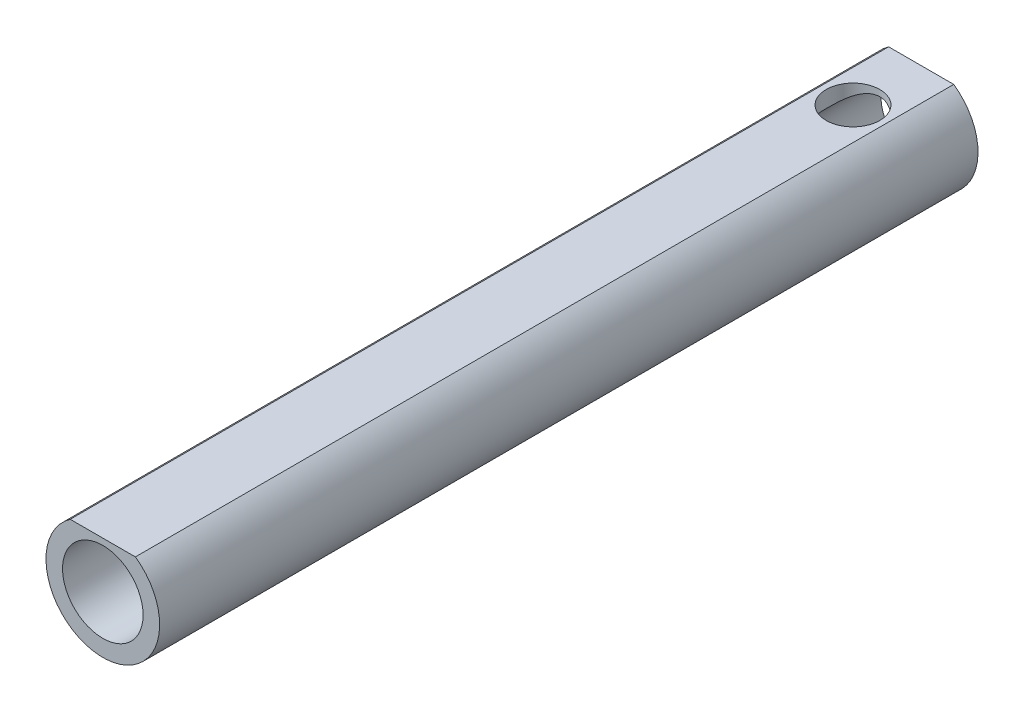
ISO-10303-21;
HEADER;
FILE_DESCRIPTION(('STEP AP214'),'2;1');
FILE_NAME('part.step','',(''),(''),'','','');
FILE_SCHEMA(('AUTOMOTIVE_DESIGN { 1 0 10303 214 1 1 1 1 }'));
ENDSEC;
DATA;
#1=APPLICATION_CONTEXT('core data for automotive mechanical design processes');
#2=APPLICATION_PROTOCOL_DEFINITION('international standard','automotive_design',2000,#1);
#3=PRODUCT_CONTEXT('',#1,'mechanical');
#4=PRODUCT('Part','Part','',(#3));
#5=PRODUCT_RELATED_PRODUCT_CATEGORY('part','',(#4));
#6=PRODUCT_DEFINITION_FORMATION('','',#4);
#7=PRODUCT_DEFINITION_CONTEXT('part definition',#1,'design');
#8=PRODUCT_DEFINITION('design','',#6,#7);
#9=PRODUCT_DEFINITION_SHAPE('','',#8);
#10=(LENGTH_UNIT() NAMED_UNIT(*) SI_UNIT(.MILLI.,.METRE.));
#11=(NAMED_UNIT(*) PLANE_ANGLE_UNIT() SI_UNIT($,.RADIAN.));
#12=(NAMED_UNIT(*) SI_UNIT($,.STERADIAN.) SOLID_ANGLE_UNIT());
#13=UNCERTAINTY_MEASURE_WITH_UNIT(LENGTH_MEASURE(1.E-05),#10,'distance_accuracy_value','');
#14=(GEOMETRIC_REPRESENTATION_CONTEXT(3) GLOBAL_UNCERTAINTY_ASSIGNED_CONTEXT((#13)) GLOBAL_UNIT_ASSIGNED_CONTEXT((#10,
#11,#12)) REPRESENTATION_CONTEXT('',''));
#15=CARTESIAN_POINT('',(0.,0.,0.));
#16=DIRECTION('',(0.,0.,1.));
#17=DIRECTION('',(1.,0.,0.));
#18=AXIS2_PLACEMENT_3D('',#15,#16,#17);
#19=CARTESIAN_POINT('',(0.,0.,45.72));
#20=DIRECTION('',(0.,0.,1.));
#21=DIRECTION('',(1.,0.,0.));
#22=AXIS2_PLACEMENT_3D('',#19,#20,#21);
#23=PLANE('',#22);
#24=DIRECTION('',(1.,0.,0.));
#25=VECTOR('',#24,1.);
#26=CARTESIAN_POINT('',(-1.81964885550264,2.60182686638983,45.72));
#27=LINE('',#26,#25);
#28=CARTESIAN_POINT('',(-1.81964885550264,2.60182686638983,45.72));
#29=VERTEX_POINT('',#28);
#30=CARTESIAN_POINT('',(1.81964885550264,2.60182686638983,45.72));
#31=VERTEX_POINT('',#30);
#32=EDGE_CURVE('E55',#29,#31,#27,.T.);
#33=ORIENTED_EDGE('',*,*,#32,.F.);
#34=CARTESIAN_POINT('',(0.,0.,45.72));
#35=DIRECTION('',(0.,0.,1.));
#36=DIRECTION('',(1.,0.,0.));
#37=AXIS2_PLACEMENT_3D('',#34,#35,#36);
#38=CIRCLE('',#37,3.175);
#39=EDGE_CURVE('E72',#29,#31,#38,.T.);
#40=ORIENTED_EDGE('',*,*,#39,.T.);
#41=EDGE_LOOP('',(#33,#40));
#42=FACE_BOUND('',#41,.T.);
#43=CARTESIAN_POINT('',(0.,0.,45.72));
#44=DIRECTION('',(0.,0.,1.));
#45=DIRECTION('',(1.,0.,0.));
#46=AXIS2_PLACEMENT_3D('',#43,#44,#45);
#47=CIRCLE('',#46,2.25);
#48=CARTESIAN_POINT('',(2.25,0.,45.72));
#49=VERTEX_POINT('',#48);
#50=EDGE_CURVE('E81',#49,#49,#47,.T.);
#51=ORIENTED_EDGE('',*,*,#50,.F.);
#52=EDGE_LOOP('',(#51));
#53=FACE_BOUND('',#52,.T.);
#54=ADVANCED_FACE('F39',(#42,#53),#23,.T.);
#55=CARTESIAN_POINT('',(0.,0.,0.));
#56=DIRECTION('',(0.,0.,1.));
#57=DIRECTION('',(1.,0.,0.));
#58=AXIS2_PLACEMENT_3D('',#55,#56,#57);
#59=PLANE('',#58);
#60=CARTESIAN_POINT('',(0.,0.,0.));
#61=DIRECTION('',(0.,0.,1.));
#62=DIRECTION('',(1.,0.,0.));
#63=AXIS2_PLACEMENT_3D('',#60,#61,#62);
#64=CIRCLE('',#63,3.175);
#65=CARTESIAN_POINT('',(-1.81964885550264,2.60182686638983,0.));
#66=VERTEX_POINT('',#65);
#67=CARTESIAN_POINT('',(1.81964885550264,2.60182686638983,0.));
#68=VERTEX_POINT('',#67);
#69=EDGE_CURVE('E77',#66,#68,#64,.T.);
#70=ORIENTED_EDGE('',*,*,#69,.F.);
#71=DIRECTION('',(1.,0.,0.));
#72=VECTOR('',#71,1.);
#73=CARTESIAN_POINT('',(0.,2.60182686638983,0.));
#74=LINE('',#73,#72);
#75=EDGE_CURVE('E64',#66,#68,#74,.T.);
#76=ORIENTED_EDGE('',*,*,#75,.T.);
#77=EDGE_LOOP('',(#70,#76));
#78=FACE_BOUND('',#77,.T.);
#79=CARTESIAN_POINT('',(0.,0.,0.));
#80=DIRECTION('',(0.,0.,1.));
#81=DIRECTION('',(1.,0.,0.));
#82=AXIS2_PLACEMENT_3D('',#79,#80,#81);
#83=CIRCLE('',#82,2.25);
#84=CARTESIAN_POINT('',(2.25,0.,0.));
#85=VERTEX_POINT('',#84);
#86=EDGE_CURVE('E84',#85,#85,#83,.T.);
#87=ORIENTED_EDGE('',*,*,#86,.T.);
#88=EDGE_LOOP('',(#87));
#89=FACE_BOUND('',#88,.T.);
#90=ADVANCED_FACE('F118',(#78,#89),#59,.F.);
#91=CARTESIAN_POINT('',(0.,0.,45.72));
#92=DIRECTION('',(0.,0.,-1.));
#93=DIRECTION('',(-1.,0.,0.));
#94=AXIS2_PLACEMENT_3D('',#91,#92,#93);
#95=CYLINDRICAL_SURFACE('',#94,3.175);
#96=ORIENTED_EDGE('',*,*,#39,.F.);
#97=DIRECTION('',(0.,0.,-1.));
#98=VECTOR('',#97,1.);
#99=CARTESIAN_POINT('',(-1.81964885550264,2.60182686638983,45.72));
#100=LINE('',#99,#98);
#101=EDGE_CURVE('E11',#29,#66,#100,.T.);
#102=ORIENTED_EDGE('',*,*,#101,.T.);
#103=ORIENTED_EDGE('',*,*,#69,.T.);
#104=DIRECTION('',(0.,0.,-1.));
#105=VECTOR('',#104,1.);
#106=CARTESIAN_POINT('',(1.81964885550264,2.60182686638983,45.72));
#107=LINE('',#106,#105);
#108=EDGE_CURVE('E48',#68,#31,#107,.F.);
#109=ORIENTED_EDGE('',*,*,#108,.T.);
#110=EDGE_LOOP('',(#96,#102,#103,#109));
#111=FACE_BOUND('',#110,.T.);
#112=ADVANCED_FACE('F41',(#111),#95,.T.);
#113=CARTESIAN_POINT('',(0.,0.,45.72));
#114=DIRECTION('',(0.,0.,-1.));
#115=DIRECTION('',(-1.,0.,0.));
#116=AXIS2_PLACEMENT_3D('',#113,#114,#115);
#117=CYLINDRICAL_SURFACE('',#116,2.25);
#118=CARTESIAN_POINT('',(0.,2.25,5.31));
#119=CARTESIAN_POINT('',(-0.0753635375010578,2.2500003123363,5.31000041222435));
#120=CARTESIAN_POINT('',(-0.150726815349676,2.24618102065041,5.30428952253338));
#121=CARTESIAN_POINT('',(-0.29904979352376,2.23128489317856,5.28180235192075));
#122=CARTESIAN_POINT('',(-0.372008335466254,2.22020461185926,5.26502081765753));
#123=CARTESIAN_POINT('',(-0.513159230890686,2.19187861803531,5.22141921200637));
#124=CARTESIAN_POINT('',(-0.581372154493165,2.17466179119986,5.19464614499405));
#125=CARTESIAN_POINT('',(-0.712061468247944,2.1354460340808,5.13220247754638));
#126=CARTESIAN_POINT('',(-0.774537023707251,2.11344640954132,5.09653058527458));
#127=CARTESIAN_POINT('',(-0.897963525577581,2.06420497027379,5.01400729697443));
#128=CARTESIAN_POINT('',(-0.958335229095506,2.0366767318449,4.96646410444283));
#129=CARTESIAN_POINT('',(-1.07079603351955,1.97986734812599,4.86320246350616));
#130=CARTESIAN_POINT('',(-1.12287304157916,1.95058372767623,4.8074723026217));
#131=CARTESIAN_POINT('',(-1.22566723309122,1.88796198509096,4.6792107242905));
#132=CARTESIAN_POINT('',(-1.27487389772063,1.85471300953349,4.60541576009742));
#133=CARTESIAN_POINT('',(-1.3601276776063,1.79313110514612,4.44872746676509));
#134=CARTESIAN_POINT('',(-1.39619755069874,1.7647897196599,4.36585019882791));
#135=CARTESIAN_POINT('',(-1.44505526258581,1.72482199981103,4.2174665299338));
#136=CARTESIAN_POINT('',(-1.46155835427012,1.71073220919327,4.15385366034463));
#137=CARTESIAN_POINT('',(-1.48612963338915,1.68943477244679,4.0239416214437));
#138=CARTESIAN_POINT('',(-1.49421235988949,1.6822152655802,3.95764728845521));
#139=CARTESIAN_POINT('',(-1.50143523105944,1.67577454206125,3.82389391585789));
#140=CARTESIAN_POINT('',(-1.5005388218823,1.67658601919217,3.7564312324116));
#141=CARTESIAN_POINT('',(-1.48978185999929,1.68614831612228,3.62277376987428));
#142=CARTESIAN_POINT('',(-1.47991371284968,1.69490586213888,3.55658011347553));
#143=CARTESIAN_POINT('',(-1.45248745663307,1.71845389493686,3.43014971157181));
#144=CARTESIAN_POINT('',(-1.4352878361075,1.7329611624773,3.36977899805771));
#145=CARTESIAN_POINT('',(-1.39402588936425,1.76632217195767,3.25273223175637));
#146=CARTESIAN_POINT('',(-1.36996130492153,1.78517734374582,3.19605740227705));
#147=CARTESIAN_POINT('',(-1.31005364054748,1.82973147303318,3.07573095353829));
#148=CARTESIAN_POINT('',(-1.27281039246576,1.85604238386761,3.01300507485891));
#149=CARTESIAN_POINT('',(-1.19001720350479,1.91018653383725,2.89396245376214));
#150=CARTESIAN_POINT('',(-1.14445701756051,1.9380216205642,2.83765375674431));
#151=CARTESIAN_POINT('',(-1.03485873983957,1.99907507793143,2.72059309071665));
#152=CARTESIAN_POINT('',(-0.968954537106748,2.03216058532537,2.66149946346645));
#153=CARTESIAN_POINT('',(-0.826505999330714,2.09413575506785,2.5551026291176));
#154=CARTESIAN_POINT('',(-0.749971724512745,2.12302933237927,2.50778839094843));
#155=CARTESIAN_POINT('',(-0.603643370318401,2.16859053066249,2.43489171102869));
#156=CARTESIAN_POINT('',(-0.535468232527862,2.18654445873746,2.40686747749468));
#157=CARTESIAN_POINT('',(-0.394527032952681,2.21630789273282,2.36092130578209));
#158=CARTESIAN_POINT('',(-0.321764909251525,2.22812259095767,2.34299082965114));
#159=CARTESIAN_POINT('',(-0.173239089878923,2.24456911617496,2.3181291260712));
#160=CARTESIAN_POINT('',(-0.0974638589505417,2.24916991845861,2.31124540429622));
#161=CARTESIAN_POINT('',(0.0543311395419323,2.25062336223889,2.30906468357843));
#162=CARTESIAN_POINT('',(0.130350889639948,2.24747654539233,2.31376687463344));
#163=CARTESIAN_POINT('',(0.274841787903197,2.23424692068197,2.33371804167145));
#164=CARTESIAN_POINT('',(0.343468083509399,2.22466684792667,2.34820297331641));
#165=CARTESIAN_POINT('',(0.477087294320545,2.19988836963629,2.38619676450965));
#166=CARTESIAN_POINT('',(0.542079628178348,2.18468906810242,2.40970706319616));
#167=CARTESIAN_POINT('',(0.670998562849498,2.14872264396868,2.46648922278369));
#168=CARTESIAN_POINT('',(0.734622138473564,2.12767402601839,2.50026611556139));
#169=CARTESIAN_POINT('',(0.855512267967967,2.08201391708633,2.5758249674597));
#170=CARTESIAN_POINT('',(0.91277486115068,2.05740022802956,2.61761187039913));
#171=CARTESIAN_POINT('',(1.02889084111743,2.00215909990073,2.71545590111813));
#172=CARTESIAN_POINT('',(1.08656390677174,1.97119617600124,2.77272469505631));
#173=CARTESIAN_POINT('',(1.19200476052087,1.90928379814468,2.89583357246784));
#174=CARTESIAN_POINT('',(1.23976570242922,1.87833436813384,2.96167952933063));
#175=CARTESIAN_POINT('',(1.32093582411985,1.82204759227935,3.09535680957609));
#176=CARTESIAN_POINT('',(1.35521727093962,1.79645697769276,3.16254902509665));
#177=CARTESIAN_POINT('',(1.41372160305198,1.75079230699616,3.30290448933272));
#178=CARTESIAN_POINT('',(1.43796259261642,1.73070834397366,3.37605670372847));
#179=CARTESIAN_POINT('',(1.47176882599005,1.70199906136974,3.51342336539656));
#180=CARTESIAN_POINT('',(1.48318948174669,1.69196248515943,3.57687885740701));
#181=CARTESIAN_POINT('',(1.49774404442529,1.67909599828798,3.70542996098879));
#182=CARTESIAN_POINT('',(1.50088695213988,1.67625826010862,3.77052371335462));
#183=CARTESIAN_POINT('',(1.4986794148595,1.67823150862486,3.90048229254277));
#184=CARTESIAN_POINT('',(1.49332394075838,1.68304702430597,3.96534696103032));
#185=CARTESIAN_POINT('',(1.47447747918559,1.69957839302618,4.09300764639908));
#186=CARTESIAN_POINT('',(1.46097563796193,1.71130345145711,4.15580078536824));
#187=CARTESIAN_POINT('',(1.42194776743121,1.743951329286,4.29428338986092));
#188=CARTESIAN_POINT('',(1.39417640348074,1.76649250181237,4.36895078470749));
#189=CARTESIAN_POINT('',(1.32813394677165,1.81666620840982,4.51161512578815));
#190=CARTESIAN_POINT('',(1.28984811255944,1.84430587265025,4.57960252349377));
#191=CARTESIAN_POINT('',(1.20298710416364,1.90212889932839,4.70946141535217));
#192=CARTESIAN_POINT('',(1.15423732420516,1.9323494054421,4.77119905906729));
#193=CARTESIAN_POINT('',(1.04753826023321,1.99221226153383,4.88649185869344));
#194=CARTESIAN_POINT('',(0.989586157693115,2.02185443124297,4.94004449777191));
#195=CARTESIAN_POINT('',(0.856092997327307,2.08223663973062,5.04503407823181));
#196=CARTESIAN_POINT('',(0.779221252166811,2.11252354087493,5.09506398013374));
#197=CARTESIAN_POINT('',(0.615651416828413,2.16583249405621,5.18093495749898));
#198=CARTESIAN_POINT('',(0.528969046836868,2.18886595083941,5.21679833011796));
#199=CARTESIAN_POINT('',(0.36857630237681,2.22076233627671,5.26586593362284));
#200=CARTESIAN_POINT('',(0.296259243943442,2.23163610276701,5.28233327932396));
#201=CARTESIAN_POINT('',(0.14929350901796,2.2462521010639,5.30439602440357));
#202=CARTESIAN_POINT('',(0.0746466271410064,2.24999969063486,5.30999959169701));
#203=CARTESIAN_POINT('',(0.,2.25,5.31));
#204=B_SPLINE_CURVE_WITH_KNOTS('',3,(#118,#119,#120,#121,#122,#123,#124,#125,#126,#127,#128,
#129,#130,#131,#132,#133,#134,#135,#136,#137,#138,#139,#140,#141,#142,#143,#144,#145,#146,#147,
#148,#149,#150,#151,#152,#153,#154,#155,#156,#157,#158,#159,#160,#161,#162,#163,#164,#165,#166,
#167,#168,#169,#170,#171,#172,#173,#174,#175,#176,#177,#178,#179,#180,#181,#182,#183,#184,#185,
#186,#187,#188,#189,#190,#191,#192,#193,#194,#195,#196,#197,#198,#199,#200,#201,#202,#203),
.UNSPECIFIED.,.T.,.F.,(4,2,2,2,2,2,2,2,2,2,2,2,2,2,2,2,2,2,2,2,2,2,2,2,2,2,2,2,2,2,2,2,2,2,2,2,
2,2,2,2,2,2,4),(0.,0.22578991987905,0.451687060761516,0.676534614892674,0.901414829005399,
1.14537771750417,1.38969308703239,1.67255012471987,1.95491479084079,2.15575270257022,
2.35624325884357,2.55755033801533,2.75902797947514,2.95161646648516,3.14426837853809,
3.37610680994695,3.60823277833819,3.8903921587134,4.17228630224798,4.39893065771344,
4.62538301355886,4.85280662469464,5.08021433648837,5.2916481359313,5.50311566352479,
5.72739260120913,5.95180841207679,6.21171132104745,6.47179314880594,6.70987451477133,
6.94752469979318,7.14243036010877,7.33712400248594,7.53193290212186,7.72700192888076,
7.9740495652692,8.22144535032241,8.47334433902139,8.7253206297639,9.01346513667897,
9.30115429919395,9.52496468523835,9.74860673443452),.UNSPECIFIED.);
#205=CARTESIAN_POINT('',(0.,2.25,5.31));
#206=VERTEX_POINT('',#205);
#207=EDGE_CURVE('E74',#206,#206,#204,.T.);
#208=ORIENTED_EDGE('',*,*,#207,.F.);
#209=EDGE_LOOP('',(#208));
#210=FACE_BOUND('',#209,.T.);
#211=ORIENTED_EDGE('',*,*,#50,.T.);
#212=EDGE_LOOP('',(#211));
#213=FACE_BOUND('',#212,.T.);
#214=ORIENTED_EDGE('',*,*,#86,.F.);
#215=EDGE_LOOP('',(#214));
#216=FACE_BOUND('',#215,.T.);
#217=ADVANCED_FACE('F102',(#210,#213,#216),#117,.F.);
#218=CARTESIAN_POINT('',(-1.81964885550264,2.60182686638983,-2.79400000000001));
#219=DIRECTION('',(0.,-1.,0.));
#220=DIRECTION('',(0.,0.,-1.));
#221=AXIS2_PLACEMENT_3D('',#218,#219,#220);
#222=PLANE('',#221);
#223=CARTESIAN_POINT('',(0.,2.60182686638983,3.81));
#224=DIRECTION('',(0.,1.,0.));
#225=DIRECTION('',(0.,0.,1.));
#226=AXIS2_PLACEMENT_3D('',#223,#224,#225);
#227=CIRCLE('',#226,1.5);
#228=CARTESIAN_POINT('',(0.,2.60182686638983,5.31));
#229=VERTEX_POINT('',#228);
#230=EDGE_CURVE('E101',#229,#229,#227,.T.);
#231=ORIENTED_EDGE('',*,*,#230,.F.);
#232=EDGE_LOOP('',(#231));
#233=FACE_BOUND('',#232,.T.);
#234=ORIENTED_EDGE('',*,*,#101,.F.);
#235=ORIENTED_EDGE('',*,*,#32,.T.);
#236=ORIENTED_EDGE('',*,*,#108,.F.);
#237=ORIENTED_EDGE('',*,*,#75,.F.);
#238=EDGE_LOOP('',(#234,#235,#236,#237));
#239=FACE_BOUND('',#238,.T.);
#240=ADVANCED_FACE('F63',(#233,#239),#222,.F.);
#241=CARTESIAN_POINT('',(0.,0.0618268663898297,3.81));
#242=DIRECTION('',(0.,1.,0.));
#243=DIRECTION('',(0.,0.,1.));
#244=AXIS2_PLACEMENT_3D('',#241,#242,#243);
#245=CYLINDRICAL_SURFACE('',#244,1.5);
#246=ORIENTED_EDGE('',*,*,#207,.T.);
#247=EDGE_LOOP('',(#246));
#248=FACE_BOUND('',#247,.T.);
#249=ORIENTED_EDGE('',*,*,#230,.T.);
#250=EDGE_LOOP('',(#249));
#251=FACE_BOUND('',#250,.T.);
#252=ADVANCED_FACE('F106',(#248,#251),#245,.F.);
#253=CLOSED_SHELL('',(#54,#90,#112,#217,#240,#252));
#254=MANIFOLD_SOLID_BREP('B2',#253);
#255=ADVANCED_BREP_SHAPE_REPRESENTATION('',(#18,#254),#14);
#256=SHAPE_DEFINITION_REPRESENTATION(#9,#255);
ENDSEC;
END-ISO-10303-21;
